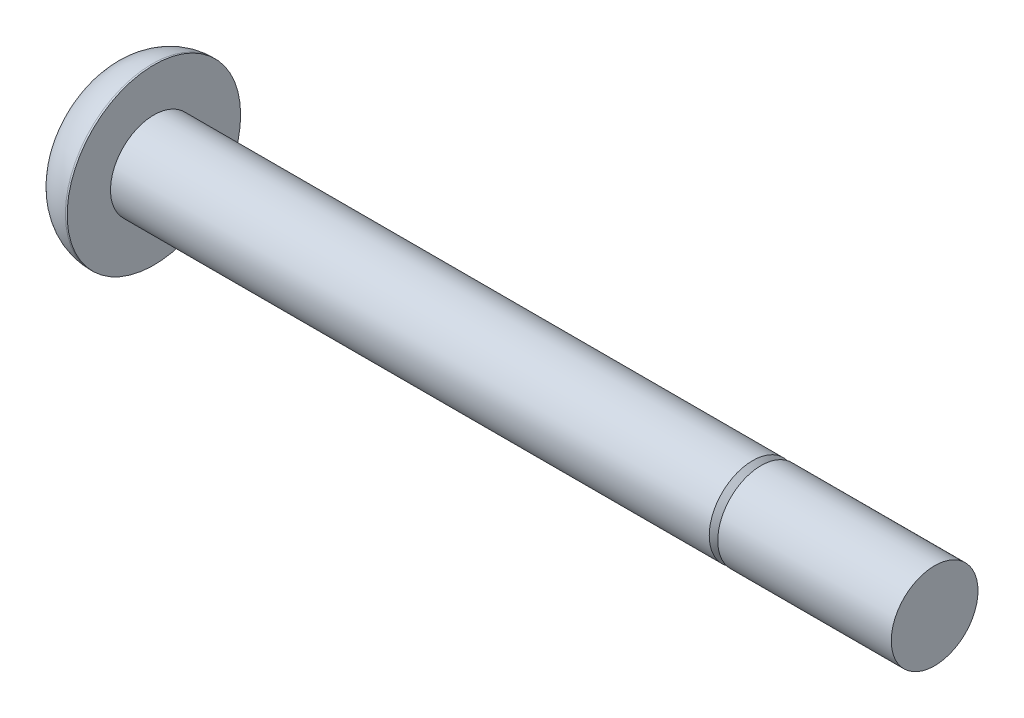
ISO-10303-21;
HEADER;
FILE_DESCRIPTION(('STEP AP214'),'2;1');
FILE_NAME('part.step','',(''),(''),'','','');
FILE_SCHEMA(('AUTOMOTIVE_DESIGN { 1 0 10303 214 1 1 1 1 }'));
ENDSEC;
DATA;
#1=APPLICATION_CONTEXT('core data for automotive mechanical design processes');
#2=APPLICATION_PROTOCOL_DEFINITION('international standard','automotive_design',2000,#1);
#3=PRODUCT_CONTEXT('',#1,'mechanical');
#4=PRODUCT('Part','Part','',(#3));
#5=PRODUCT_RELATED_PRODUCT_CATEGORY('part','',(#4));
#6=PRODUCT_DEFINITION_FORMATION('','',#4);
#7=PRODUCT_DEFINITION_CONTEXT('part definition',#1,'design');
#8=PRODUCT_DEFINITION('design','',#6,#7);
#9=PRODUCT_DEFINITION_SHAPE('','',#8);
#10=(LENGTH_UNIT() NAMED_UNIT(*) SI_UNIT(.MILLI.,.METRE.));
#11=(NAMED_UNIT(*) PLANE_ANGLE_UNIT() SI_UNIT($,.RADIAN.));
#12=(NAMED_UNIT(*) SI_UNIT($,.STERADIAN.) SOLID_ANGLE_UNIT());
#13=UNCERTAINTY_MEASURE_WITH_UNIT(LENGTH_MEASURE(1.E-05),#10,'distance_accuracy_value','');
#14=(GEOMETRIC_REPRESENTATION_CONTEXT(3) GLOBAL_UNCERTAINTY_ASSIGNED_CONTEXT((#13)) GLOBAL_UNIT_ASSIGNED_CONTEXT((#10,
#11,#12)) REPRESENTATION_CONTEXT('',''));
#15=CARTESIAN_POINT('',(0.,0.,0.));
#16=DIRECTION('',(0.,0.,1.));
#17=DIRECTION('',(1.,0.,0.));
#18=AXIS2_PLACEMENT_3D('',#15,#16,#17);
#19=CARTESIAN_POINT('',(1.93397459628386,0.,0.));
#20=DIRECTION('',(-1.,0.,0.));
#21=DIRECTION('',(0.,0.,1.));
#22=AXIS2_PLACEMENT_3D('',#19,#20,#21);
#23=CONICAL_SURFACE('',#22,1.499999999794,1.04719755099793);
#24=CARTESIAN_POINT('',(2.79999999995084,3.41060513164848E-10,0.));
#25=VERTEX_POINT('',#24);
#26=VERTEX_LOOP('',#25);
#27=FACE_BOUND('',#26,.T.);
#28=CARTESIAN_POINT('',(1.93397459621556,0.,0.));
#29=DIRECTION('',(1.,0.,0.));
#30=DIRECTION('',(0.,0.,-1.));
#31=AXIS2_PLACEMENT_3D('',#28,#29,#30);
#32=CIRCLE('',#31,1.5);
#33=CARTESIAN_POINT('',(1.93397459621556,0.,-1.5));
#34=VERTEX_POINT('',#33);
#35=EDGE_CURVE('E121',#34,#34,#32,.F.);
#36=ORIENTED_EDGE('',*,*,#35,.T.);
#37=EDGE_LOOP('',(#36));
#38=FACE_BOUND('',#37,.T.);
#39=ADVANCED_FACE('F17',(#27,#38),#23,.F.);
#40=CARTESIAN_POINT('',(0.966987298107781,0.,0.));
#41=DIRECTION('',(1.,0.,0.));
#42=DIRECTION('',(0.,0.,-1.));
#43=AXIS2_PLACEMENT_3D('',#40,#41,#42);
#44=CYLINDRICAL_SURFACE('',#43,1.5);
#45=ORIENTED_EDGE('',*,*,#35,.F.);
#46=EDGE_LOOP('',(#45));
#47=FACE_BOUND('',#46,.T.);
#48=CARTESIAN_POINT('',(1.82,0.,0.));
#49=DIRECTION('',(1.,0.,0.));
#50=DIRECTION('',(0.,0.,-1.));
#51=AXIS2_PLACEMENT_3D('',#48,#49,#50);
#52=CIRCLE('',#51,1.5);
#53=CARTESIAN_POINT('',(1.82,1.29903810567666,-0.75));
#54=VERTEX_POINT('',#53);
#55=CARTESIAN_POINT('',(1.82,1.29903810567666,0.749999999999999));
#56=VERTEX_POINT('',#55);
#57=EDGE_CURVE('E94',#54,#56,#52,.T.);
#58=ORIENTED_EDGE('',*,*,#57,.F.);
#59=CARTESIAN_POINT('',(1.82,0.,0.));
#60=DIRECTION('',(1.,0.,0.));
#61=DIRECTION('',(0.,0.,-1.));
#62=AXIS2_PLACEMENT_3D('',#59,#60,#61);
#63=CIRCLE('',#62,1.5);
#64=CARTESIAN_POINT('',(1.82,0.,-1.5));
#65=VERTEX_POINT('',#64);
#66=EDGE_CURVE('E102',#65,#54,#63,.T.);
#67=ORIENTED_EDGE('',*,*,#66,.F.);
#68=CARTESIAN_POINT('',(1.82,0.,0.));
#69=DIRECTION('',(1.,0.,0.));
#70=DIRECTION('',(0.,0.,-1.));
#71=AXIS2_PLACEMENT_3D('',#68,#69,#70);
#72=CIRCLE('',#71,1.5);
#73=CARTESIAN_POINT('',(1.82,-1.29903810567666,-0.749999999999999));
#74=VERTEX_POINT('',#73);
#75=EDGE_CURVE('E131',#65,#74,#72,.F.);
#76=ORIENTED_EDGE('',*,*,#75,.T.);
#77=CARTESIAN_POINT('',(1.82,0.,0.));
#78=DIRECTION('',(1.,0.,0.));
#79=DIRECTION('',(0.,0.,-1.));
#80=AXIS2_PLACEMENT_3D('',#77,#78,#79);
#81=CIRCLE('',#80,1.5);
#82=CARTESIAN_POINT('',(1.82,-1.29903810567666,0.750000000000001));
#83=VERTEX_POINT('',#82);
#84=EDGE_CURVE('E101',#74,#83,#81,.F.);
#85=ORIENTED_EDGE('',*,*,#84,.T.);
#86=CARTESIAN_POINT('',(1.82,0.,0.));
#87=DIRECTION('',(1.,0.,0.));
#88=DIRECTION('',(0.,0.,-1.));
#89=AXIS2_PLACEMENT_3D('',#86,#87,#88);
#90=CIRCLE('',#89,1.5);
#91=CARTESIAN_POINT('',(1.82,0.,1.5));
#92=VERTEX_POINT('',#91);
#93=EDGE_CURVE('E120',#92,#83,#90,.T.);
#94=ORIENTED_EDGE('',*,*,#93,.F.);
#95=CARTESIAN_POINT('',(1.82,0.,0.));
#96=DIRECTION('',(1.,0.,0.));
#97=DIRECTION('',(0.,0.,-1.));
#98=AXIS2_PLACEMENT_3D('',#95,#96,#97);
#99=CIRCLE('',#98,1.5);
#100=EDGE_CURVE('E20',#56,#92,#99,.T.);
#101=ORIENTED_EDGE('',*,*,#100,.F.);
#102=EDGE_LOOP('',(#58,#67,#76,#85,#94,#101));
#103=FACE_BOUND('',#102,.T.);
#104=ADVANCED_FACE('F118',(#47,#103),#44,.F.);
#105=CARTESIAN_POINT('',(1.82,0.,0.));
#106=DIRECTION('',(1.,0.,0.));
#107=DIRECTION('',(0.,0.,-1.));
#108=AXIS2_PLACEMENT_3D('',#105,#106,#107);
#109=PLANE('',#108);
#110=DIRECTION('',(0.,0.5,-0.866025403784439));
#111=VECTOR('',#110,1.);
#112=CARTESIAN_POINT('',(1.82,-0.866025403784439,-1.5));
#113=LINE('',#112,#111);
#114=CARTESIAN_POINT('',(1.82,-1.73205080756888,0.));
#115=VERTEX_POINT('',#114);
#116=EDGE_CURVE('E159',#74,#115,#113,.F.);
#117=ORIENTED_EDGE('',*,*,#116,.T.);
#118=DIRECTION('',(0.,-0.5,-0.866025403784439));
#119=VECTOR('',#118,1.);
#120=CARTESIAN_POINT('',(1.82,-1.73205080756888,0.));
#121=LINE('',#120,#119);
#122=EDGE_CURVE('E170',#115,#83,#121,.F.);
#123=ORIENTED_EDGE('',*,*,#122,.T.);
#124=ORIENTED_EDGE('',*,*,#84,.F.);
#125=EDGE_LOOP('',(#117,#123,#124));
#126=FACE_BOUND('',#125,.T.);
#127=ADVANCED_FACE('F441',(#126),#109,.F.);
#128=CARTESIAN_POINT('',(1.82,0.,0.));
#129=DIRECTION('',(1.,0.,0.));
#130=DIRECTION('',(0.,0.,-1.));
#131=AXIS2_PLACEMENT_3D('',#128,#129,#130);
#132=PLANE('',#131);
#133=DIRECTION('',(0.,1.,0.));
#134=VECTOR('',#133,1.);
#135=CARTESIAN_POINT('',(1.82,0.866025403784439,-1.5));
#136=LINE('',#135,#134);
#137=CARTESIAN_POINT('',(1.82,-0.866025403784439,-1.5));
#138=VERTEX_POINT('',#137);
#139=EDGE_CURVE('E180',#65,#138,#136,.F.);
#140=ORIENTED_EDGE('',*,*,#139,.T.);
#141=DIRECTION('',(0.,0.5,-0.866025403784439));
#142=VECTOR('',#141,1.);
#143=CARTESIAN_POINT('',(1.82,-0.866025403784439,-1.5));
#144=LINE('',#143,#142);
#145=EDGE_CURVE('E133',#138,#74,#144,.F.);
#146=ORIENTED_EDGE('',*,*,#145,.T.);
#147=ORIENTED_EDGE('',*,*,#75,.F.);
#148=EDGE_LOOP('',(#140,#146,#147));
#149=FACE_BOUND('',#148,.T.);
#150=ADVANCED_FACE('F431',(#149),#132,.F.);
#151=CARTESIAN_POINT('',(0.,-0.866025403784439,-1.5));
#152=DIRECTION('',(0.,-0.866025403784439,-0.5));
#153=DIRECTION('',(0.,0.5,-0.866025403784439));
#154=AXIS2_PLACEMENT_3D('',#151,#152,#153);
#155=PLANE('',#154);
#156=DIRECTION('',(1.,0.,0.));
#157=VECTOR('',#156,1.);
#158=CARTESIAN_POINT('',(0.,-1.73205080756888,0.));
#159=LINE('',#158,#157);
#160=CARTESIAN_POINT('',(0.,-1.73205080756888,0.));
#161=VERTEX_POINT('',#160);
#162=EDGE_CURVE('E165',#161,#115,#159,.T.);
#163=ORIENTED_EDGE('',*,*,#162,.T.);
#164=ORIENTED_EDGE('',*,*,#116,.F.);
#165=ORIENTED_EDGE('',*,*,#145,.F.);
#166=DIRECTION('',(-1.,0.,0.));
#167=VECTOR('',#166,1.);
#168=CARTESIAN_POINT('',(0.,-0.866025403784439,-1.5));
#169=LINE('',#168,#167);
#170=CARTESIAN_POINT('',(0.,-0.866025403784439,-1.5));
#171=VERTEX_POINT('',#170);
#172=EDGE_CURVE('E156',#138,#171,#169,.T.);
#173=ORIENTED_EDGE('',*,*,#172,.T.);
#174=DIRECTION('',(0.,0.5,-0.866025403784439));
#175=VECTOR('',#174,1.);
#176=CARTESIAN_POINT('',(0.,-0.866025403784439,-1.5));
#177=LINE('',#176,#175);
#178=EDGE_CURVE('E161',#161,#171,#177,.T.);
#179=ORIENTED_EDGE('',*,*,#178,.F.);
#180=EDGE_LOOP('',(#163,#164,#165,#173,#179));
#181=FACE_BOUND('',#180,.T.);
#182=ADVANCED_FACE('F421',(#181),#155,.F.);
#183=CARTESIAN_POINT('',(0.,-1.73205080756888,0.));
#184=DIRECTION('',(0.,-0.866025403784439,0.5));
#185=DIRECTION('',(0.,-0.5,-0.866025403784439));
#186=AXIS2_PLACEMENT_3D('',#183,#184,#185);
#187=PLANE('',#186);
#188=DIRECTION('',(1.,0.,0.));
#189=VECTOR('',#188,1.);
#190=CARTESIAN_POINT('',(0.,-0.866025403784439,1.5));
#191=LINE('',#190,#189);
#192=CARTESIAN_POINT('',(0.,-0.86602540378444,1.5));
#193=VERTEX_POINT('',#192);
#194=CARTESIAN_POINT('',(1.82,-0.866025403784439,1.5));
#195=VERTEX_POINT('',#194);
#196=EDGE_CURVE('E155',#193,#195,#191,.T.);
#197=ORIENTED_EDGE('',*,*,#196,.T.);
#198=DIRECTION('',(0.,-0.500000000000001,-0.866025403784438));
#199=VECTOR('',#198,1.);
#200=CARTESIAN_POINT('',(1.82,-0.866025403784439,1.5));
#201=LINE('',#200,#199);
#202=EDGE_CURVE('E193',#195,#83,#201,.T.);
#203=ORIENTED_EDGE('',*,*,#202,.T.);
#204=ORIENTED_EDGE('',*,*,#122,.F.);
#205=ORIENTED_EDGE('',*,*,#162,.F.);
#206=DIRECTION('',(0.,-0.5,-0.866025403784439));
#207=VECTOR('',#206,1.);
#208=CARTESIAN_POINT('',(0.,-1.73205080756888,0.));
#209=LINE('',#208,#207);
#210=EDGE_CURVE('E175',#193,#161,#209,.T.);
#211=ORIENTED_EDGE('',*,*,#210,.F.);
#212=EDGE_LOOP('',(#197,#203,#204,#205,#211));
#213=FACE_BOUND('',#212,.T.);
#214=ADVANCED_FACE('F412',(#213),#187,.F.);
#215=CARTESIAN_POINT('',(1.82,0.,0.));
#216=DIRECTION('',(1.,0.,0.));
#217=DIRECTION('',(0.,0.,-1.));
#218=AXIS2_PLACEMENT_3D('',#215,#216,#217);
#219=PLANE('',#218);
#220=ORIENTED_EDGE('',*,*,#202,.F.);
#221=DIRECTION('',(0.,1.,0.));
#222=VECTOR('',#221,1.);
#223=CARTESIAN_POINT('',(1.82,-0.866025403784439,1.5));
#224=LINE('',#223,#222);
#225=EDGE_CURVE('E200',#195,#92,#224,.T.);
#226=ORIENTED_EDGE('',*,*,#225,.T.);
#227=ORIENTED_EDGE('',*,*,#93,.T.);
#228=EDGE_LOOP('',(#220,#226,#227));
#229=FACE_BOUND('',#228,.T.);
#230=ADVANCED_FACE('F402',(#229),#219,.F.);
#231=CARTESIAN_POINT('',(1.82,0.,0.));
#232=DIRECTION('',(1.,0.,0.));
#233=DIRECTION('',(0.,0.,-1.));
#234=AXIS2_PLACEMENT_3D('',#231,#232,#233);
#235=PLANE('',#234);
#236=DIRECTION('',(0.,0.5,0.866025403784439));
#237=VECTOR('',#236,1.);
#238=CARTESIAN_POINT('',(1.82,1.73205080756888,0.));
#239=LINE('',#238,#237);
#240=CARTESIAN_POINT('',(1.82,0.866025403784441,-1.5));
#241=VERTEX_POINT('',#240);
#242=EDGE_CURVE('E210',#54,#241,#239,.F.);
#243=ORIENTED_EDGE('',*,*,#242,.T.);
#244=DIRECTION('',(0.,1.,0.));
#245=VECTOR('',#244,1.);
#246=CARTESIAN_POINT('',(1.82,0.866025403784439,-1.5));
#247=LINE('',#246,#245);
#248=EDGE_CURVE('E188',#241,#65,#247,.F.);
#249=ORIENTED_EDGE('',*,*,#248,.T.);
#250=ORIENTED_EDGE('',*,*,#66,.T.);
#251=EDGE_LOOP('',(#243,#249,#250));
#252=FACE_BOUND('',#251,.T.);
#253=ADVANCED_FACE('F392',(#252),#235,.F.);
#254=CARTESIAN_POINT('',(0.,0.866025403784439,-1.5));
#255=DIRECTION('',(0.,0.,-1.));
#256=DIRECTION('',(-1.,0.,0.));
#257=AXIS2_PLACEMENT_3D('',#254,#255,#256);
#258=PLANE('',#257);
#259=ORIENTED_EDGE('',*,*,#172,.F.);
#260=ORIENTED_EDGE('',*,*,#139,.F.);
#261=ORIENTED_EDGE('',*,*,#248,.F.);
#262=DIRECTION('',(1.,0.,0.));
#263=VECTOR('',#262,1.);
#264=CARTESIAN_POINT('',(0.,0.866025403784441,-1.5));
#265=LINE('',#264,#263);
#266=CARTESIAN_POINT('',(0.,0.86602540378444,-1.5));
#267=VERTEX_POINT('',#266);
#268=EDGE_CURVE('E207',#241,#267,#265,.F.);
#269=ORIENTED_EDGE('',*,*,#268,.T.);
#270=DIRECTION('',(0.,1.,0.));
#271=VECTOR('',#270,1.);
#272=CARTESIAN_POINT('',(0.,0.866025403784439,-1.5));
#273=LINE('',#272,#271);
#274=EDGE_CURVE('E153',#171,#267,#273,.T.);
#275=ORIENTED_EDGE('',*,*,#274,.F.);
#276=EDGE_LOOP('',(#259,#260,#261,#269,#275));
#277=FACE_BOUND('',#276,.T.);
#278=ADVANCED_FACE('F382',(#277),#258,.F.);
#279=CARTESIAN_POINT('',(0.,-0.866025403784439,1.5));
#280=DIRECTION('',(0.,0.,1.));
#281=DIRECTION('',(1.,0.,0.));
#282=AXIS2_PLACEMENT_3D('',#279,#280,#281);
#283=PLANE('',#282);
#284=DIRECTION('',(1.,0.,0.));
#285=VECTOR('',#284,1.);
#286=CARTESIAN_POINT('',(0.,0.866025403784439,1.5));
#287=LINE('',#286,#285);
#288=CARTESIAN_POINT('',(0.,0.866025403784439,1.5));
#289=VERTEX_POINT('',#288);
#290=CARTESIAN_POINT('',(1.82,0.866025403784439,1.5));
#291=VERTEX_POINT('',#290);
#292=EDGE_CURVE('E115',#289,#291,#287,.T.);
#293=ORIENTED_EDGE('',*,*,#292,.T.);
#294=DIRECTION('',(0.,1.,0.));
#295=VECTOR('',#294,1.);
#296=CARTESIAN_POINT('',(1.82,0.,1.5));
#297=LINE('',#296,#295);
#298=EDGE_CURVE('E114',#291,#92,#297,.F.);
#299=ORIENTED_EDGE('',*,*,#298,.T.);
#300=ORIENTED_EDGE('',*,*,#225,.F.);
#301=ORIENTED_EDGE('',*,*,#196,.F.);
#302=DIRECTION('',(0.,1.,0.));
#303=VECTOR('',#302,1.);
#304=CARTESIAN_POINT('',(0.,-0.866025403784439,1.5));
#305=LINE('',#304,#303);
#306=EDGE_CURVE('E204',#289,#193,#305,.F.);
#307=ORIENTED_EDGE('',*,*,#306,.F.);
#308=EDGE_LOOP('',(#293,#299,#300,#301,#307));
#309=FACE_BOUND('',#308,.T.);
#310=ADVANCED_FACE('F373',(#309),#283,.F.);
#311=CARTESIAN_POINT('',(1.82,0.,0.));
#312=DIRECTION('',(1.,0.,0.));
#313=DIRECTION('',(0.,0.,-1.));
#314=AXIS2_PLACEMENT_3D('',#311,#312,#313);
#315=PLANE('',#314);
#316=ORIENTED_EDGE('',*,*,#298,.F.);
#317=DIRECTION('',(0.,-0.5,0.866025403784439));
#318=VECTOR('',#317,1.);
#319=CARTESIAN_POINT('',(1.82,0.866025403784439,1.5));
#320=LINE('',#319,#318);
#321=EDGE_CURVE('E109',#291,#56,#320,.F.);
#322=ORIENTED_EDGE('',*,*,#321,.T.);
#323=ORIENTED_EDGE('',*,*,#100,.T.);
#324=EDGE_LOOP('',(#316,#322,#323));
#325=FACE_BOUND('',#324,.T.);
#326=ADVANCED_FACE('F113',(#325),#315,.F.);
#327=CARTESIAN_POINT('',(1.82,0.,0.));
#328=DIRECTION('',(1.,0.,0.));
#329=DIRECTION('',(0.,0.,-1.));
#330=AXIS2_PLACEMENT_3D('',#327,#328,#329);
#331=PLANE('',#330);
#332=DIRECTION('',(0.,-0.5,0.866025403784439));
#333=VECTOR('',#332,1.);
#334=CARTESIAN_POINT('',(1.82,0.866025403784439,1.5));
#335=LINE('',#334,#333);
#336=CARTESIAN_POINT('',(1.82,1.73205080756888,0.));
#337=VERTEX_POINT('',#336);
#338=EDGE_CURVE('E97',#56,#337,#335,.F.);
#339=ORIENTED_EDGE('',*,*,#338,.T.);
#340=DIRECTION('',(0.,0.5,0.866025403784439));
#341=VECTOR('',#340,1.);
#342=CARTESIAN_POINT('',(1.82,1.73205080756888,0.));
#343=LINE('',#342,#341);
#344=EDGE_CURVE('E99',#337,#54,#343,.F.);
#345=ORIENTED_EDGE('',*,*,#344,.T.);
#346=ORIENTED_EDGE('',*,*,#57,.T.);
#347=EDGE_LOOP('',(#339,#345,#346));
#348=FACE_BOUND('',#347,.T.);
#349=ADVANCED_FACE('F96',(#348),#331,.F.);
#350=CARTESIAN_POINT('',(0.,1.73205080756888,0.));
#351=DIRECTION('',(0.,0.866025403784439,-0.5));
#352=DIRECTION('',(0.,0.5,0.866025403784439));
#353=AXIS2_PLACEMENT_3D('',#350,#351,#352);
#354=PLANE('',#353);
#355=ORIENTED_EDGE('',*,*,#268,.F.);
#356=ORIENTED_EDGE('',*,*,#242,.F.);
#357=ORIENTED_EDGE('',*,*,#344,.F.);
#358=DIRECTION('',(1.,0.,0.));
#359=VECTOR('',#358,1.);
#360=CARTESIAN_POINT('',(0.,1.73205080756888,0.));
#361=LINE('',#360,#359);
#362=CARTESIAN_POINT('',(0.,1.73205080756888,0.));
#363=VERTEX_POINT('',#362);
#364=EDGE_CURVE('E111',#337,#363,#361,.F.);
#365=ORIENTED_EDGE('',*,*,#364,.T.);
#366=DIRECTION('',(0.,0.5,0.866025403784439));
#367=VECTOR('',#366,1.);
#368=CARTESIAN_POINT('',(0.,1.73205080756888,0.));
#369=LINE('',#368,#367);
#370=EDGE_CURVE('E35',#267,#363,#369,.T.);
#371=ORIENTED_EDGE('',*,*,#370,.F.);
#372=EDGE_LOOP('',(#355,#356,#357,#365,#371));
#373=FACE_BOUND('',#372,.T.);
#374=ADVANCED_FACE('F347',(#373),#354,.F.);
#375=CARTESIAN_POINT('',(0.,0.866025403784439,1.5));
#376=DIRECTION('',(0.,0.866025403784439,0.5));
#377=DIRECTION('',(0.,-0.5,0.866025403784439));
#378=AXIS2_PLACEMENT_3D('',#375,#376,#377);
#379=PLANE('',#378);
#380=ORIENTED_EDGE('',*,*,#364,.F.);
#381=ORIENTED_EDGE('',*,*,#338,.F.);
#382=ORIENTED_EDGE('',*,*,#321,.F.);
#383=ORIENTED_EDGE('',*,*,#292,.F.);
#384=DIRECTION('',(0.,-0.500000000000001,0.866025403784438));
#385=VECTOR('',#384,1.);
#386=CARTESIAN_POINT('',(0.,1.73205080756888,0.));
#387=LINE('',#386,#385);
#388=EDGE_CURVE('E138',#363,#289,#387,.T.);
#389=ORIENTED_EDGE('',*,*,#388,.F.);
#390=EDGE_LOOP('',(#380,#381,#382,#383,#389));
#391=FACE_BOUND('',#390,.T.);
#392=ADVANCED_FACE('F107',(#391),#379,.F.);
#393=CARTESIAN_POINT('',(47.8,0.,0.));
#394=DIRECTION('',(1.,0.,0.));
#395=DIRECTION('',(0.,0.,-1.));
#396=AXIS2_PLACEMENT_3D('',#393,#394,#395);
#397=PLANE('',#396);
#398=CARTESIAN_POINT('',(47.8,0.,0.));
#399=DIRECTION('',(1.,0.,0.));
#400=DIRECTION('',(0.,0.,-1.));
#401=AXIS2_PLACEMENT_3D('',#398,#399,#400);
#402=CIRCLE('',#401,2.5);
#403=CARTESIAN_POINT('',(47.8,0.,-2.5));
#404=VERTEX_POINT('',#403);
#405=EDGE_CURVE('E134',#404,#404,#402,.F.);
#406=ORIENTED_EDGE('',*,*,#405,.F.);
#407=EDGE_LOOP('',(#406));
#408=FACE_BOUND('',#407,.T.);
#409=ADVANCED_FACE('F328',(#408),#397,.T.);
#410=CARTESIAN_POINT('',(0.,1.15,0.));
#411=DIRECTION('',(-1.,0.,0.));
#412=DIRECTION('',(0.,0.,1.));
#413=AXIS2_PLACEMENT_3D('',#410,#411,#412);
#414=PLANE('',#413);
#415=CARTESIAN_POINT('',(0.,0.,0.));
#416=DIRECTION('',(-1.,0.,0.));
#417=DIRECTION('',(0.,0.,1.));
#418=AXIS2_PLACEMENT_3D('',#415,#416,#417);
#419=CIRCLE('',#418,2.3);
#420=CARTESIAN_POINT('',(0.,0.,2.3));
#421=VERTEX_POINT('',#420);
#422=EDGE_CURVE('E137',#421,#421,#419,.F.);
#423=ORIENTED_EDGE('',*,*,#422,.F.);
#424=EDGE_LOOP('',(#423));
#425=FACE_BOUND('',#424,.T.);
#426=ORIENTED_EDGE('',*,*,#370,.T.);
#427=ORIENTED_EDGE('',*,*,#388,.T.);
#428=ORIENTED_EDGE('',*,*,#306,.T.);
#429=ORIENTED_EDGE('',*,*,#210,.T.);
#430=ORIENTED_EDGE('',*,*,#178,.T.);
#431=ORIENTED_EDGE('',*,*,#274,.T.);
#432=EDGE_LOOP('',(#426,#427,#428,#429,#430,#431));
#433=FACE_BOUND('',#432,.T.);
#434=ADVANCED_FACE('F318',(#425,#433),#414,.T.);
#435=CARTESIAN_POINT('',(37.8,0.,0.));
#436=DIRECTION('',(1.,0.,0.));
#437=DIRECTION('',(0.,0.,-1.));
#438=AXIS2_PLACEMENT_3D('',#435,#436,#437);
#439=CYLINDRICAL_SURFACE('',#438,2.5);
#440=CARTESIAN_POINT('',(37.8,0.,0.));
#441=DIRECTION('',(1.,0.,0.));
#442=DIRECTION('',(0.,0.,-1.));
#443=AXIS2_PLACEMENT_3D('',#440,#441,#442);
#444=CIRCLE('',#443,2.5);
#445=CARTESIAN_POINT('',(37.8,0.,-2.5));
#446=VERTEX_POINT('',#445);
#447=EDGE_CURVE('E141',#446,#446,#444,.T.);
#448=ORIENTED_EDGE('',*,*,#447,.T.);
#449=EDGE_LOOP('',(#448));
#450=FACE_BOUND('',#449,.T.);
#451=ORIENTED_EDGE('',*,*,#405,.T.);
#452=EDGE_LOOP('',(#451));
#453=FACE_BOUND('',#452,.T.);
#454=ADVANCED_FACE('F308',(#450,#453),#439,.T.);
#455=CARTESIAN_POINT('',(2.7,0.,0.));
#456=DIRECTION('',(-1.,0.,0.));
#457=DIRECTION('',(0.,1.,0.));
#458=AXIS2_PLACEMENT_3D('',#455,#456,#457);
#459=DEGENERATE_TOROIDAL_SURFACE('',#458,2.3,2.7,.T.);
#460=ORIENTED_EDGE('',*,*,#422,.T.);
#461=EDGE_LOOP('',(#460));
#462=FACE_BOUND('',#461,.T.);
#463=CARTESIAN_POINT('',(2.7,0.,0.));
#464=DIRECTION('',(1.,0.,0.));
#465=DIRECTION('',(0.,0.,-1.));
#466=AXIS2_PLACEMENT_3D('',#463,#464,#465);
#467=CIRCLE('',#466,5.);
#468=CARTESIAN_POINT('',(2.7,0.,-5.));
#469=VERTEX_POINT('',#468);
#470=EDGE_CURVE('E144',#469,#469,#467,.T.);
#471=ORIENTED_EDGE('',*,*,#470,.F.);
#472=EDGE_LOOP('',(#471));
#473=FACE_BOUND('',#472,.T.);
#474=ADVANCED_FACE('F298',(#462,#473),#459,.T.);
#475=CARTESIAN_POINT('',(37.8,0.,0.));
#476=DIRECTION('',(1.,0.,0.));
#477=DIRECTION('',(0.,0.,-1.));
#478=AXIS2_PLACEMENT_3D('',#475,#476,#477);
#479=PLANE('',#478);
#480=CARTESIAN_POINT('',(37.8000000000043,0.,0.));
#481=DIRECTION('',(-1.,0.,0.));
#482=DIRECTION('',(0.,0.,1.));
#483=AXIS2_PLACEMENT_3D('',#480,#481,#482);
#484=CIRCLE('',#483,2.00949999992872);
#485=CARTESIAN_POINT('',(37.8000000000043,0.,2.00949999992872));
#486=VERTEX_POINT('',#485);
#487=EDGE_CURVE('E145',#486,#486,#484,.T.);
#488=ORIENTED_EDGE('',*,*,#487,.F.);
#489=EDGE_LOOP('',(#488));
#490=FACE_BOUND('',#489,.T.);
#491=ORIENTED_EDGE('',*,*,#447,.F.);
#492=EDGE_LOOP('',(#491));
#493=FACE_BOUND('',#492,.T.);
#494=ADVANCED_FACE('F263',(#490,#493),#479,.F.);
#495=CARTESIAN_POINT('',(2.75,0.,0.));
#496=DIRECTION('',(1.,0.,0.));
#497=DIRECTION('',(0.,0.,-1.));
#498=AXIS2_PLACEMENT_3D('',#495,#496,#497);
#499=CYLINDRICAL_SURFACE('',#498,5.);
#500=ORIENTED_EDGE('',*,*,#470,.T.);
#501=EDGE_LOOP('',(#500));
#502=FACE_BOUND('',#501,.T.);
#503=CARTESIAN_POINT('',(2.8,0.,0.));
#504=DIRECTION('',(1.,0.,0.));
#505=DIRECTION('',(0.,0.,-1.));
#506=AXIS2_PLACEMENT_3D('',#503,#504,#505);
#507=CIRCLE('',#506,5.);
#508=CARTESIAN_POINT('',(2.8,0.,-5.));
#509=VERTEX_POINT('',#508);
#510=EDGE_CURVE('E148',#509,#509,#507,.T.);
#511=ORIENTED_EDGE('',*,*,#510,.F.);
#512=EDGE_LOOP('',(#511));
#513=FACE_BOUND('',#512,.T.);
#514=ADVANCED_FACE('F253',(#502,#513),#499,.T.);
#515=CARTESIAN_POINT('',(37.3094999999921,0.,0.));
#516=DIRECTION('',(-1.,0.,0.));
#517=DIRECTION('',(0.,0.,1.));
#518=AXIS2_PLACEMENT_3D('',#515,#516,#517);
#519=CONICAL_SURFACE('',#518,2.49999999999773,0.785398163455393);
#520=ORIENTED_EDGE('',*,*,#487,.T.);
#521=EDGE_LOOP('',(#520));
#522=FACE_BOUND('',#521,.T.);
#523=CARTESIAN_POINT('',(37.3095,0.,0.));
#524=DIRECTION('',(1.,0.,0.));
#525=DIRECTION('',(0.,0.,-1.));
#526=AXIS2_PLACEMENT_3D('',#523,#524,#525);
#527=CIRCLE('',#526,2.5);
#528=CARTESIAN_POINT('',(37.3095,0.,-2.5));
#529=VERTEX_POINT('',#528);
#530=EDGE_CURVE('E26',#529,#529,#527,.F.);
#531=ORIENTED_EDGE('',*,*,#530,.F.);
#532=EDGE_LOOP('',(#531));
#533=FACE_BOUND('',#532,.T.);
#534=ADVANCED_FACE('F250',(#522,#533),#519,.T.);
#535=CARTESIAN_POINT('',(2.8,3.75,0.));
#536=DIRECTION('',(1.,0.,0.));
#537=DIRECTION('',(0.,0.,-1.));
#538=AXIS2_PLACEMENT_3D('',#535,#536,#537);
#539=PLANE('',#538);
#540=CARTESIAN_POINT('',(2.8,0.,0.));
#541=DIRECTION('',(1.,0.,0.));
#542=DIRECTION('',(0.,0.,-1.));
#543=AXIS2_PLACEMENT_3D('',#540,#541,#542);
#544=CIRCLE('',#543,2.5);
#545=CARTESIAN_POINT('',(2.8,0.,-2.5));
#546=VERTEX_POINT('',#545);
#547=EDGE_CURVE('E11',#546,#546,#544,.T.);
#548=ORIENTED_EDGE('',*,*,#547,.F.);
#549=EDGE_LOOP('',(#548));
#550=FACE_BOUND('',#549,.T.);
#551=ORIENTED_EDGE('',*,*,#510,.T.);
#552=EDGE_LOOP('',(#551));
#553=FACE_BOUND('',#552,.T.);
#554=ADVANCED_FACE('F252',(#550,#553),#539,.T.);
#555=CARTESIAN_POINT('',(20.05475,0.,0.));
#556=DIRECTION('',(1.,0.,0.));
#557=DIRECTION('',(0.,0.,-1.));
#558=AXIS2_PLACEMENT_3D('',#555,#556,#557);
#559=CYLINDRICAL_SURFACE('',#558,2.5);
#560=ORIENTED_EDGE('',*,*,#530,.T.);
#561=EDGE_LOOP('',(#560));
#562=FACE_BOUND('',#561,.T.);
#563=ORIENTED_EDGE('',*,*,#547,.T.);
#564=EDGE_LOOP('',(#563));
#565=FACE_BOUND('',#564,.T.);
#566=ADVANCED_FACE('F247',(#562,#565),#559,.T.);
#567=CLOSED_SHELL('',(#39,#104,#127,#150,#182,#214,#230,#253,#278,#310,#326,#349,#374,#392,#409,
#434,#454,#474,#494,#514,#534,#554,#566));
#568=MANIFOLD_SOLID_BREP('B1',#567);
#569=ADVANCED_BREP_SHAPE_REPRESENTATION('',(#18,#568),#14);
#570=SHAPE_DEFINITION_REPRESENTATION(#9,#569);
ENDSEC;
END-ISO-10303-21;
